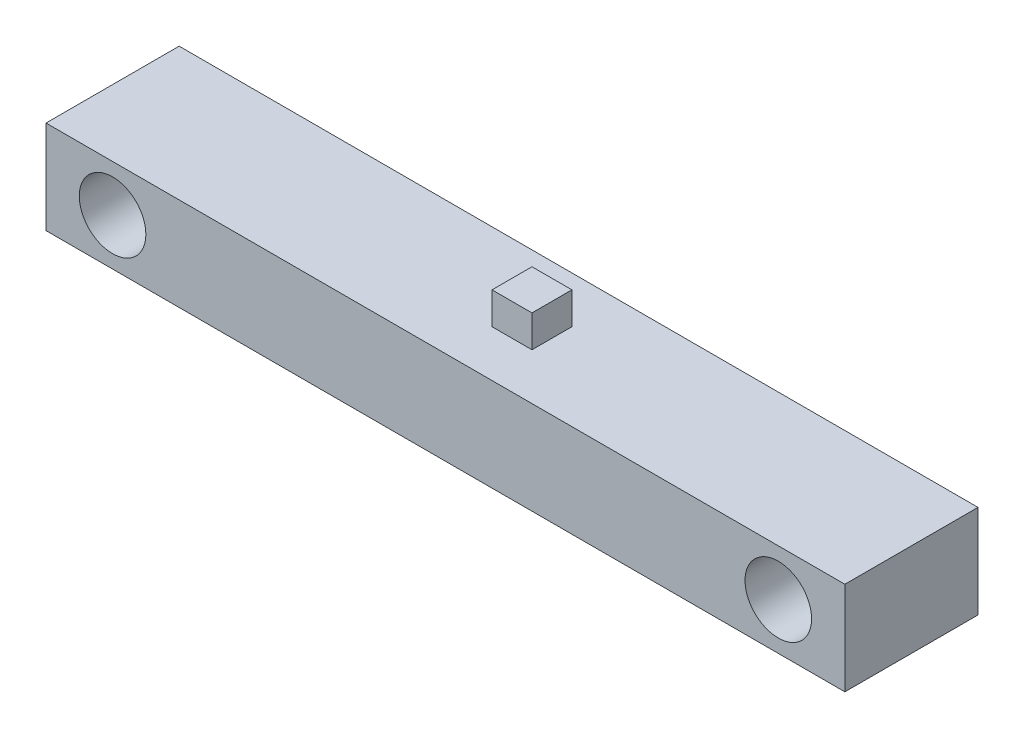
ISO-10303-21;
HEADER;
FILE_DESCRIPTION(('STEP AP214'),'2;1');
FILE_NAME('part.step','',(''),(''),'','','');
FILE_SCHEMA(('AUTOMOTIVE_DESIGN { 1 0 10303 214 1 1 1 1 }'));
ENDSEC;
DATA;
#1=APPLICATION_CONTEXT('core data for automotive mechanical design processes');
#2=APPLICATION_PROTOCOL_DEFINITION('international standard','automotive_design',2000,#1);
#3=PRODUCT_CONTEXT('',#1,'mechanical');
#4=PRODUCT('Part','Part','',(#3));
#5=PRODUCT_RELATED_PRODUCT_CATEGORY('part','',(#4));
#6=PRODUCT_DEFINITION_FORMATION('','',#4);
#7=PRODUCT_DEFINITION_CONTEXT('part definition',#1,'design');
#8=PRODUCT_DEFINITION('design','',#6,#7);
#9=PRODUCT_DEFINITION_SHAPE('','',#8);
#10=(LENGTH_UNIT() NAMED_UNIT(*) SI_UNIT(.MILLI.,.METRE.));
#11=(NAMED_UNIT(*) PLANE_ANGLE_UNIT() SI_UNIT($,.RADIAN.));
#12=(NAMED_UNIT(*) SI_UNIT($,.STERADIAN.) SOLID_ANGLE_UNIT());
#13=UNCERTAINTY_MEASURE_WITH_UNIT(LENGTH_MEASURE(1.E-05),#10,'distance_accuracy_value','');
#14=(GEOMETRIC_REPRESENTATION_CONTEXT(3) GLOBAL_UNCERTAINTY_ASSIGNED_CONTEXT((#13)) GLOBAL_UNIT_ASSIGNED_CONTEXT((#10,
#11,#12)) REPRESENTATION_CONTEXT('',''));
#15=CARTESIAN_POINT('',(0.,0.,0.));
#16=DIRECTION('',(0.,0.,1.));
#17=DIRECTION('',(1.,0.,0.));
#18=AXIS2_PLACEMENT_3D('',#15,#16,#17);
#19=CARTESIAN_POINT('',(0.,35.,0.));
#20=DIRECTION('',(0.,1.,0.));
#21=DIRECTION('',(0.,0.,1.));
#22=AXIS2_PLACEMENT_3D('',#19,#20,#21);
#23=PLANE('',#22);
#24=DIRECTION('',(0.,0.,1.));
#25=VECTOR('',#24,1.);
#26=CARTESIAN_POINT('',(-150.,35.,-50.));
#27=LINE('',#26,#25);
#28=CARTESIAN_POINT('',(-150.,35.,-50.));
#29=VERTEX_POINT('',#28);
#30=CARTESIAN_POINT('',(-150.,35.,0.));
#31=VERTEX_POINT('',#30);
#32=EDGE_CURVE('E158',#29,#31,#27,.T.);
#33=ORIENTED_EDGE('',*,*,#32,.T.);
#34=DIRECTION('',(1.,0.,0.));
#35=VECTOR('',#34,1.);
#36=CARTESIAN_POINT('',(-150.,35.,0.));
#37=LINE('',#36,#35);
#38=CARTESIAN_POINT('',(150.,35.,0.));
#39=VERTEX_POINT('',#38);
#40=EDGE_CURVE('E98',#31,#39,#37,.T.);
#41=ORIENTED_EDGE('',*,*,#40,.T.);
#42=DIRECTION('',(0.,0.,-1.));
#43=VECTOR('',#42,1.);
#44=CARTESIAN_POINT('',(150.,35.,-50.));
#45=LINE('',#44,#43);
#46=CARTESIAN_POINT('',(150.,35.,-50.));
#47=VERTEX_POINT('',#46);
#48=EDGE_CURVE('E163',#39,#47,#45,.T.);
#49=ORIENTED_EDGE('',*,*,#48,.T.);
#50=DIRECTION('',(-1.,0.,0.));
#51=VECTOR('',#50,1.);
#52=CARTESIAN_POINT('',(-150.,35.,-50.));
#53=LINE('',#52,#51);
#54=EDGE_CURVE('E70',#47,#29,#53,.T.);
#55=ORIENTED_EDGE('',*,*,#54,.T.);
#56=EDGE_LOOP('',(#33,#41,#49,#55));
#57=FACE_BOUND('',#56,.T.);
#58=DIRECTION('',(1.,0.,0.));
#59=VECTOR('',#58,1.);
#60=CARTESIAN_POINT('',(0.,35.,-17.5));
#61=LINE('',#60,#59);
#62=CARTESIAN_POINT('',(0.,35.,-17.5));
#63=VERTEX_POINT('',#62);
#64=CARTESIAN_POINT('',(15.,35.,-17.5));
#65=VERTEX_POINT('',#64);
#66=EDGE_CURVE('E246',#63,#65,#61,.T.);
#67=ORIENTED_EDGE('',*,*,#66,.F.);
#68=DIRECTION('',(0.,0.,1.));
#69=VECTOR('',#68,1.);
#70=CARTESIAN_POINT('',(0.,35.,-32.5));
#71=LINE('',#70,#69);
#72=CARTESIAN_POINT('',(0.,35.,-32.5));
#73=VERTEX_POINT('',#72);
#74=EDGE_CURVE('E145',#73,#63,#71,.T.);
#75=ORIENTED_EDGE('',*,*,#74,.F.);
#76=DIRECTION('',(-1.,0.,0.));
#77=VECTOR('',#76,1.);
#78=CARTESIAN_POINT('',(0.,35.,-32.5));
#79=LINE('',#78,#77);
#80=CARTESIAN_POINT('',(15.,35.,-32.5));
#81=VERTEX_POINT('',#80);
#82=EDGE_CURVE('E141',#81,#73,#79,.T.);
#83=ORIENTED_EDGE('',*,*,#82,.F.);
#84=DIRECTION('',(0.,0.,-1.));
#85=VECTOR('',#84,1.);
#86=CARTESIAN_POINT('',(15.,35.,-32.5));
#87=LINE('',#86,#85);
#88=EDGE_CURVE('E265',#65,#81,#87,.T.);
#89=ORIENTED_EDGE('',*,*,#88,.F.);
#90=EDGE_LOOP('',(#67,#75,#83,#89));
#91=FACE_BOUND('',#90,.T.);
#92=ADVANCED_FACE('F45',(#57,#91),#23,.T.);
#93=CARTESIAN_POINT('',(-150.,35.,-50.));
#94=DIRECTION('',(1.,0.,0.));
#95=DIRECTION('',(0.,0.,-1.));
#96=AXIS2_PLACEMENT_3D('',#93,#94,#95);
#97=PLANE('',#96);
#98=DIRECTION('',(0.,0.,1.));
#99=VECTOR('',#98,1.);
#100=CARTESIAN_POINT('',(-150.,0.,-50.));
#101=LINE('',#100,#99);
#102=CARTESIAN_POINT('',(-150.,0.,-50.));
#103=VERTEX_POINT('',#102);
#104=CARTESIAN_POINT('',(-150.,0.,0.));
#105=VERTEX_POINT('',#104);
#106=EDGE_CURVE('E148',#103,#105,#101,.T.);
#107=ORIENTED_EDGE('',*,*,#106,.T.);
#108=DIRECTION('',(0.,-1.,0.));
#109=VECTOR('',#108,1.);
#110=CARTESIAN_POINT('',(-150.,35.,0.));
#111=LINE('',#110,#109);
#112=EDGE_CURVE('E11',#31,#105,#111,.T.);
#113=ORIENTED_EDGE('',*,*,#112,.F.);
#114=ORIENTED_EDGE('',*,*,#32,.F.);
#115=DIRECTION('',(0.,-1.,0.));
#116=VECTOR('',#115,1.);
#117=CARTESIAN_POINT('',(-150.,35.,-50.));
#118=LINE('',#117,#116);
#119=EDGE_CURVE('E167',#29,#103,#118,.T.);
#120=ORIENTED_EDGE('',*,*,#119,.T.);
#121=EDGE_LOOP('',(#107,#113,#114,#120));
#122=FACE_BOUND('',#121,.T.);
#123=ADVANCED_FACE('F47',(#122),#97,.F.);
#124=CARTESIAN_POINT('',(-150.,35.,0.));
#125=DIRECTION('',(0.,0.,-1.));
#126=DIRECTION('',(-1.,0.,0.));
#127=AXIS2_PLACEMENT_3D('',#124,#125,#126);
#128=PLANE('',#127);
#129=CARTESIAN_POINT('',(-125.,17.5,0.));
#130=DIRECTION('',(0.,0.,1.));
#131=DIRECTION('',(1.,0.,0.));
#132=AXIS2_PLACEMENT_3D('',#129,#130,#131);
#133=CIRCLE('',#132,12.5);
#134=CARTESIAN_POINT('',(-112.5,17.5,0.));
#135=VERTEX_POINT('',#134);
#136=EDGE_CURVE('E239',#135,#135,#133,.T.);
#137=ORIENTED_EDGE('',*,*,#136,.F.);
#138=EDGE_LOOP('',(#137));
#139=FACE_BOUND('',#138,.T.);
#140=CARTESIAN_POINT('',(125.,17.5,0.));
#141=DIRECTION('',(0.,0.,1.));
#142=DIRECTION('',(1.,0.,0.));
#143=AXIS2_PLACEMENT_3D('',#140,#141,#142);
#144=CIRCLE('',#143,12.5);
#145=CARTESIAN_POINT('',(137.5,17.5,0.));
#146=VERTEX_POINT('',#145);
#147=EDGE_CURVE('E248',#146,#146,#144,.T.);
#148=ORIENTED_EDGE('',*,*,#147,.F.);
#149=EDGE_LOOP('',(#148));
#150=FACE_BOUND('',#149,.T.);
#151=DIRECTION('',(1.,0.,0.));
#152=VECTOR('',#151,1.);
#153=CARTESIAN_POINT('',(-150.,0.,0.));
#154=LINE('',#153,#152);
#155=CARTESIAN_POINT('',(150.,0.,0.));
#156=VERTEX_POINT('',#155);
#157=EDGE_CURVE('E153',#105,#156,#154,.T.);
#158=ORIENTED_EDGE('',*,*,#157,.T.);
#159=DIRECTION('',(0.,-1.,0.));
#160=VECTOR('',#159,1.);
#161=CARTESIAN_POINT('',(150.,35.,0.));
#162=LINE('',#161,#160);
#163=EDGE_CURVE('E54',#39,#156,#162,.T.);
#164=ORIENTED_EDGE('',*,*,#163,.F.);
#165=ORIENTED_EDGE('',*,*,#40,.F.);
#166=ORIENTED_EDGE('',*,*,#112,.T.);
#167=EDGE_LOOP('',(#158,#164,#165,#166));
#168=FACE_BOUND('',#167,.T.);
#169=ADVANCED_FACE('F204',(#139,#150,#168),#128,.F.);
#170=CARTESIAN_POINT('',(150.,35.,-50.));
#171=DIRECTION('',(-1.,0.,0.));
#172=DIRECTION('',(0.,0.,1.));
#173=AXIS2_PLACEMENT_3D('',#170,#171,#172);
#174=PLANE('',#173);
#175=DIRECTION('',(0.,0.,-1.));
#176=VECTOR('',#175,1.);
#177=CARTESIAN_POINT('',(150.,0.,-50.));
#178=LINE('',#177,#176);
#179=CARTESIAN_POINT('',(150.,0.,-50.));
#180=VERTEX_POINT('',#179);
#181=EDGE_CURVE('E171',#156,#180,#178,.T.);
#182=ORIENTED_EDGE('',*,*,#181,.T.);
#183=DIRECTION('',(0.,-1.,0.));
#184=VECTOR('',#183,1.);
#185=CARTESIAN_POINT('',(150.,35.,-50.));
#186=LINE('',#185,#184);
#187=EDGE_CURVE('E178',#47,#180,#186,.T.);
#188=ORIENTED_EDGE('',*,*,#187,.F.);
#189=ORIENTED_EDGE('',*,*,#48,.F.);
#190=ORIENTED_EDGE('',*,*,#163,.T.);
#191=EDGE_LOOP('',(#182,#188,#189,#190));
#192=FACE_BOUND('',#191,.T.);
#193=ADVANCED_FACE('F185',(#192),#174,.F.);
#194=CARTESIAN_POINT('',(-150.,35.,-50.));
#195=DIRECTION('',(0.,0.,1.));
#196=DIRECTION('',(1.,0.,0.));
#197=AXIS2_PLACEMENT_3D('',#194,#195,#196);
#198=PLANE('',#197);
#199=CARTESIAN_POINT('',(-125.,17.5,-50.));
#200=DIRECTION('',(0.,0.,1.));
#201=DIRECTION('',(1.,0.,0.));
#202=AXIS2_PLACEMENT_3D('',#199,#200,#201);
#203=CIRCLE('',#202,12.5);
#204=CARTESIAN_POINT('',(-112.5,17.5,-50.));
#205=VERTEX_POINT('',#204);
#206=EDGE_CURVE('E241',#205,#205,#203,.F.);
#207=ORIENTED_EDGE('',*,*,#206,.F.);
#208=EDGE_LOOP('',(#207));
#209=FACE_BOUND('',#208,.T.);
#210=CARTESIAN_POINT('',(125.,17.5,-50.));
#211=DIRECTION('',(0.,0.,1.));
#212=DIRECTION('',(1.,0.,0.));
#213=AXIS2_PLACEMENT_3D('',#210,#211,#212);
#214=CIRCLE('',#213,12.5);
#215=CARTESIAN_POINT('',(137.5,17.5,-50.));
#216=VERTEX_POINT('',#215);
#217=EDGE_CURVE('E251',#216,#216,#214,.F.);
#218=ORIENTED_EDGE('',*,*,#217,.F.);
#219=EDGE_LOOP('',(#218));
#220=FACE_BOUND('',#219,.T.);
#221=DIRECTION('',(-1.,0.,0.));
#222=VECTOR('',#221,1.);
#223=CARTESIAN_POINT('',(-150.,0.,-50.));
#224=LINE('',#223,#222);
#225=EDGE_CURVE('E91',#180,#103,#224,.T.);
#226=ORIENTED_EDGE('',*,*,#225,.T.);
#227=ORIENTED_EDGE('',*,*,#119,.F.);
#228=ORIENTED_EDGE('',*,*,#54,.F.);
#229=ORIENTED_EDGE('',*,*,#187,.T.);
#230=EDGE_LOOP('',(#226,#227,#228,#229));
#231=FACE_BOUND('',#230,.T.);
#232=ADVANCED_FACE('F193',(#209,#220,#231),#198,.F.);
#233=CARTESIAN_POINT('',(0.,0.,0.));
#234=DIRECTION('',(0.,1.,0.));
#235=DIRECTION('',(0.,0.,1.));
#236=AXIS2_PLACEMENT_3D('',#233,#234,#235);
#237=PLANE('',#236);
#238=ORIENTED_EDGE('',*,*,#106,.F.);
#239=ORIENTED_EDGE('',*,*,#225,.F.);
#240=ORIENTED_EDGE('',*,*,#181,.F.);
#241=ORIENTED_EDGE('',*,*,#157,.F.);
#242=EDGE_LOOP('',(#238,#239,#240,#241));
#243=FACE_BOUND('',#242,.T.);
#244=ADVANCED_FACE('F189',(#243),#237,.F.);
#245=CARTESIAN_POINT('',(0.,47.,-32.5));
#246=DIRECTION('',(1.,0.,0.));
#247=DIRECTION('',(0.,0.,-1.));
#248=AXIS2_PLACEMENT_3D('',#245,#246,#247);
#249=PLANE('',#248);
#250=ORIENTED_EDGE('',*,*,#74,.T.);
#251=DIRECTION('',(0.,-1.,0.));
#252=VECTOR('',#251,1.);
#253=CARTESIAN_POINT('',(0.,47.,-17.5));
#254=LINE('',#253,#252);
#255=CARTESIAN_POINT('',(0.,47.,-17.5));
#256=VERTEX_POINT('',#255);
#257=EDGE_CURVE('E124',#256,#63,#254,.T.);
#258=ORIENTED_EDGE('',*,*,#257,.F.);
#259=DIRECTION('',(0.,0.,1.));
#260=VECTOR('',#259,1.);
#261=CARTESIAN_POINT('',(0.,47.,-32.5));
#262=LINE('',#261,#260);
#263=CARTESIAN_POINT('',(0.,47.,-32.5));
#264=VERTEX_POINT('',#263);
#265=EDGE_CURVE('E132',#264,#256,#262,.T.);
#266=ORIENTED_EDGE('',*,*,#265,.F.);
#267=DIRECTION('',(0.,-1.,0.));
#268=VECTOR('',#267,1.);
#269=CARTESIAN_POINT('',(0.,47.,-32.5));
#270=LINE('',#269,#268);
#271=EDGE_CURVE('E261',#264,#73,#270,.T.);
#272=ORIENTED_EDGE('',*,*,#271,.T.);
#273=EDGE_LOOP('',(#250,#258,#266,#272));
#274=FACE_BOUND('',#273,.T.);
#275=ADVANCED_FACE('F143',(#274),#249,.F.);
#276=CARTESIAN_POINT('',(0.,47.,-17.5));
#277=DIRECTION('',(0.,0.,-1.));
#278=DIRECTION('',(-1.,0.,0.));
#279=AXIS2_PLACEMENT_3D('',#276,#277,#278);
#280=PLANE('',#279);
#281=ORIENTED_EDGE('',*,*,#66,.T.);
#282=DIRECTION('',(0.,-1.,0.));
#283=VECTOR('',#282,1.);
#284=CARTESIAN_POINT('',(15.,47.,-17.5));
#285=LINE('',#284,#283);
#286=CARTESIAN_POINT('',(15.,47.,-17.5));
#287=VERTEX_POINT('',#286);
#288=EDGE_CURVE('E127',#287,#65,#285,.T.);
#289=ORIENTED_EDGE('',*,*,#288,.F.);
#290=DIRECTION('',(1.,0.,0.));
#291=VECTOR('',#290,1.);
#292=CARTESIAN_POINT('',(0.,47.,-17.5));
#293=LINE('',#292,#291);
#294=EDGE_CURVE('E120',#256,#287,#293,.T.);
#295=ORIENTED_EDGE('',*,*,#294,.F.);
#296=ORIENTED_EDGE('',*,*,#257,.T.);
#297=EDGE_LOOP('',(#281,#289,#295,#296));
#298=FACE_BOUND('',#297,.T.);
#299=ADVANCED_FACE('F122',(#298),#280,.F.);
#300=CARTESIAN_POINT('',(15.,47.,-32.5));
#301=DIRECTION('',(-1.,0.,0.));
#302=DIRECTION('',(0.,0.,1.));
#303=AXIS2_PLACEMENT_3D('',#300,#301,#302);
#304=PLANE('',#303);
#305=ORIENTED_EDGE('',*,*,#88,.T.);
#306=DIRECTION('',(0.,-1.,0.));
#307=VECTOR('',#306,1.);
#308=CARTESIAN_POINT('',(15.,47.,-32.5));
#309=LINE('',#308,#307);
#310=CARTESIAN_POINT('',(15.,47.,-32.5));
#311=VERTEX_POINT('',#310);
#312=EDGE_CURVE('E61',#311,#81,#309,.T.);
#313=ORIENTED_EDGE('',*,*,#312,.F.);
#314=DIRECTION('',(0.,0.,-1.));
#315=VECTOR('',#314,1.);
#316=CARTESIAN_POINT('',(15.,47.,-32.5));
#317=LINE('',#316,#315);
#318=EDGE_CURVE('E131',#287,#311,#317,.T.);
#319=ORIENTED_EDGE('',*,*,#318,.F.);
#320=ORIENTED_EDGE('',*,*,#288,.T.);
#321=EDGE_LOOP('',(#305,#313,#319,#320));
#322=FACE_BOUND('',#321,.T.);
#323=ADVANCED_FACE('F219',(#322),#304,.F.);
#324=CARTESIAN_POINT('',(0.,47.,-32.5));
#325=DIRECTION('',(0.,0.,1.));
#326=DIRECTION('',(1.,0.,0.));
#327=AXIS2_PLACEMENT_3D('',#324,#325,#326);
#328=PLANE('',#327);
#329=ORIENTED_EDGE('',*,*,#82,.T.);
#330=ORIENTED_EDGE('',*,*,#271,.F.);
#331=DIRECTION('',(-1.,0.,0.));
#332=VECTOR('',#331,1.);
#333=CARTESIAN_POINT('',(0.,47.,-32.5));
#334=LINE('',#333,#332);
#335=EDGE_CURVE('E136',#311,#264,#334,.T.);
#336=ORIENTED_EDGE('',*,*,#335,.F.);
#337=ORIENTED_EDGE('',*,*,#312,.T.);
#338=EDGE_LOOP('',(#329,#330,#336,#337));
#339=FACE_BOUND('',#338,.T.);
#340=ADVANCED_FACE('F222',(#339),#328,.F.);
#341=CARTESIAN_POINT('',(0.,47.,0.));
#342=DIRECTION('',(0.,1.,0.));
#343=DIRECTION('',(0.,0.,1.));
#344=AXIS2_PLACEMENT_3D('',#341,#342,#343);
#345=PLANE('',#344);
#346=ORIENTED_EDGE('',*,*,#265,.T.);
#347=ORIENTED_EDGE('',*,*,#294,.T.);
#348=ORIENTED_EDGE('',*,*,#318,.T.);
#349=ORIENTED_EDGE('',*,*,#335,.T.);
#350=EDGE_LOOP('',(#346,#347,#348,#349));
#351=FACE_BOUND('',#350,.T.);
#352=ADVANCED_FACE('F135',(#351),#345,.T.);
#353=CARTESIAN_POINT('',(125.,17.5,-50.001));
#354=DIRECTION('',(0.,0.,1.));
#355=DIRECTION('',(1.,0.,0.));
#356=AXIS2_PLACEMENT_3D('',#353,#354,#355);
#357=CYLINDRICAL_SURFACE('',#356,12.5);
#358=ORIENTED_EDGE('',*,*,#147,.T.);
#359=EDGE_LOOP('',(#358));
#360=FACE_BOUND('',#359,.T.);
#361=ORIENTED_EDGE('',*,*,#217,.T.);
#362=EDGE_LOOP('',(#361));
#363=FACE_BOUND('',#362,.T.);
#364=ADVANCED_FACE('F228',(#360,#363),#357,.F.);
#365=CARTESIAN_POINT('',(-125.,17.5,-50.001));
#366=DIRECTION('',(0.,0.,1.));
#367=DIRECTION('',(1.,0.,0.));
#368=AXIS2_PLACEMENT_3D('',#365,#366,#367);
#369=CYLINDRICAL_SURFACE('',#368,12.5);
#370=ORIENTED_EDGE('',*,*,#136,.T.);
#371=EDGE_LOOP('',(#370));
#372=FACE_BOUND('',#371,.T.);
#373=ORIENTED_EDGE('',*,*,#206,.T.);
#374=EDGE_LOOP('',(#373));
#375=FACE_BOUND('',#374,.T.);
#376=ADVANCED_FACE('F230',(#372,#375),#369,.F.);
#377=CLOSED_SHELL('',(#92,#123,#169,#193,#232,#244,#275,#299,#323,#340,#352,#364,#376));
#378=MANIFOLD_SOLID_BREP('B2',#377);
#379=ADVANCED_BREP_SHAPE_REPRESENTATION('',(#18,#378),#14);
#380=SHAPE_DEFINITION_REPRESENTATION(#9,#379);
ENDSEC;
END-ISO-10303-21;
